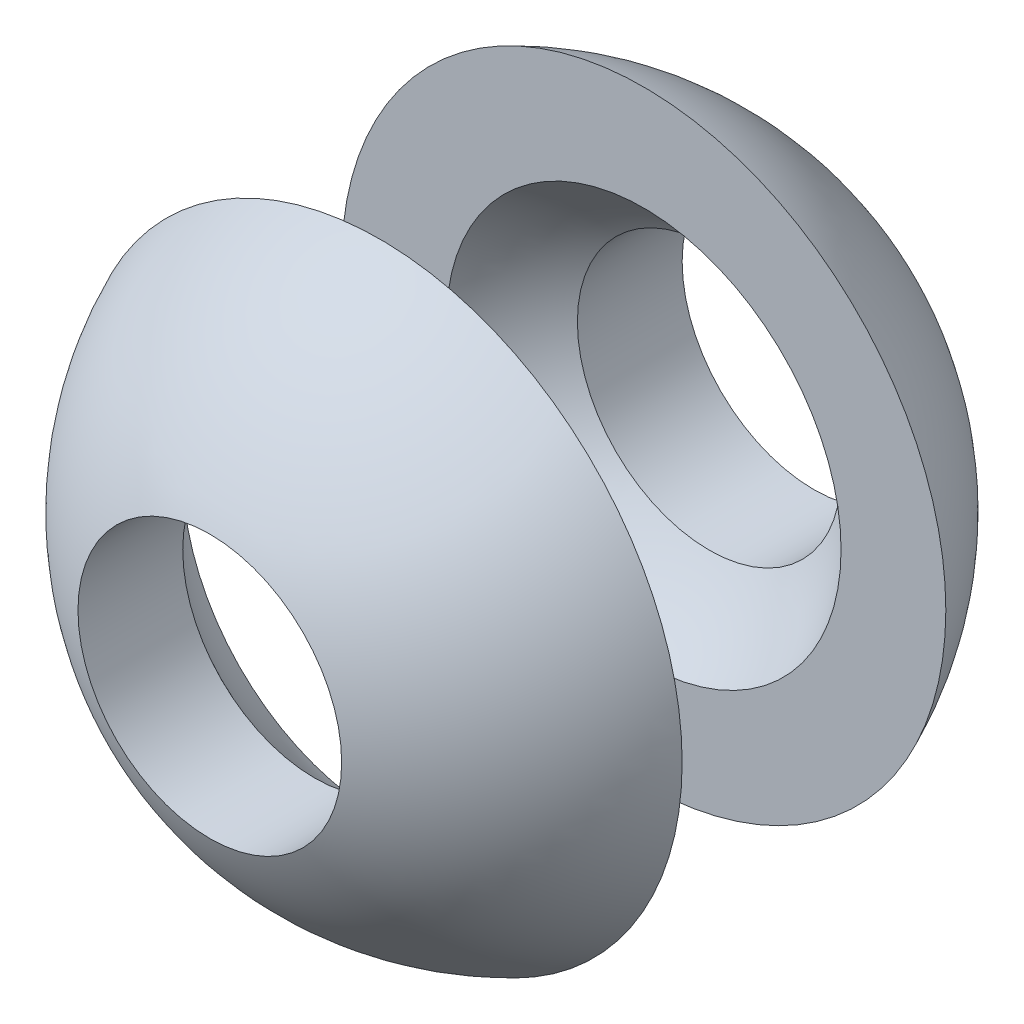
ISO-10303-21;
HEADER;
FILE_DESCRIPTION(('STEP AP214'),'2;1');
FILE_NAME('part.step','',(''),(''),'','','');
FILE_SCHEMA(('AUTOMOTIVE_DESIGN { 1 0 10303 214 1 1 1 1 }'));
ENDSEC;
DATA;
#1=APPLICATION_CONTEXT('core data for automotive mechanical design processes');
#2=APPLICATION_PROTOCOL_DEFINITION('international standard','automotive_design',2000,#1);
#3=PRODUCT_CONTEXT('',#1,'mechanical');
#4=PRODUCT('Part','Part','',(#3));
#5=PRODUCT_RELATED_PRODUCT_CATEGORY('part','',(#4));
#6=PRODUCT_DEFINITION_FORMATION('','',#4);
#7=PRODUCT_DEFINITION_CONTEXT('part definition',#1,'design');
#8=PRODUCT_DEFINITION('design','',#6,#7);
#9=PRODUCT_DEFINITION_SHAPE('','',#8);
#10=(LENGTH_UNIT() NAMED_UNIT(*) SI_UNIT(.MILLI.,.METRE.));
#11=(NAMED_UNIT(*) PLANE_ANGLE_UNIT() SI_UNIT($,.RADIAN.));
#12=(NAMED_UNIT(*) SI_UNIT($,.STERADIAN.) SOLID_ANGLE_UNIT());
#13=UNCERTAINTY_MEASURE_WITH_UNIT(LENGTH_MEASURE(1.E-05),#10,'distance_accuracy_value','');
#14=(GEOMETRIC_REPRESENTATION_CONTEXT(3) GLOBAL_UNCERTAINTY_ASSIGNED_CONTEXT((#13)) GLOBAL_UNIT_ASSIGNED_CONTEXT((#10,
#11,#12)) REPRESENTATION_CONTEXT('',''));
#15=CARTESIAN_POINT('',(0.,0.,0.));
#16=DIRECTION('',(0.,0.,1.));
#17=DIRECTION('',(1.,0.,0.));
#18=AXIS2_PLACEMENT_3D('',#15,#16,#17);
#19=CARTESIAN_POINT('',(0.,0.,-5.));
#20=DIRECTION('',(0.,0.,-1.));
#21=DIRECTION('',(-1.,0.,0.));
#22=AXIS2_PLACEMENT_3D('',#19,#20,#21);
#23=PLANE('',#22);
#24=CARTESIAN_POINT('',(0.,0.,-5.));
#25=DIRECTION('',(0.,0.,-1.));
#26=DIRECTION('',(-1.,0.,0.));
#27=AXIS2_PLACEMENT_3D('',#24,#25,#26);
#28=CIRCLE('',#27,11.4564392373896);
#29=CARTESIAN_POINT('',(11.4564392373896,0.,-5.));
#30=VERTEX_POINT('',#29);
#31=EDGE_CURVE('E11',#30,#30,#28,.T.);
#32=ORIENTED_EDGE('',*,*,#31,.F.);
#33=EDGE_LOOP('',(#32));
#34=FACE_BOUND('',#33,.T.);
#35=CARTESIAN_POINT('',(0.,0.,-5.));
#36=DIRECTION('',(0.,0.,-1.));
#37=DIRECTION('',(-1.,0.,0.));
#38=AXIS2_PLACEMENT_3D('',#35,#36,#37);
#39=CIRCLE('',#38,7.48331477354788);
#40=CARTESIAN_POINT('',(7.48331477354789,0.,-5.));
#41=VERTEX_POINT('',#40);
#42=EDGE_CURVE('E55',#41,#41,#39,.T.);
#43=ORIENTED_EDGE('',*,*,#42,.T.);
#44=EDGE_LOOP('',(#43));
#45=FACE_BOUND('',#44,.T.);
#46=ADVANCED_FACE('F41',(#34,#45),#23,.F.);
#47=CARTESIAN_POINT('',(0.,0.,0.));
#48=DIRECTION('',(0.,0.,-1.));
#49=DIRECTION('',(1.,0.,0.));
#50=AXIS2_PLACEMENT_3D('',#47,#48,#49);
#51=SPHERICAL_SURFACE('',#50,12.5);
#52=CARTESIAN_POINT('',(0.,0.,-11.4564392373896));
#53=DIRECTION('',(0.,0.,-1.));
#54=DIRECTION('',(-1.,0.,0.));
#55=AXIS2_PLACEMENT_3D('',#52,#53,#54);
#56=CIRCLE('',#55,5.);
#57=CARTESIAN_POINT('',(5.,0.,-11.4564392373896));
#58=VERTEX_POINT('',#57);
#59=EDGE_CURVE('E47',#58,#58,#56,.T.);
#60=CARTESIAN_POINT('',(5.,0.,-11.4564392373896));
#61=CARTESIAN_POINT('',(5.089236522876,0.,-11.4174934692092));
#62=CARTESIAN_POINT('',(5.17801782567667,0.,-11.3775046833718));
#63=CARTESIAN_POINT('',(5.35462192760605,0.,-11.29546379955));
#64=CARTESIAN_POINT('',(5.44244472673478,0.,-11.2534117015655));
#65=CARTESIAN_POINT('',(5.61708375779903,0.,-11.1672669166161));
#66=CARTESIAN_POINT('',(5.70389998973455,0.,-11.1231742296511));
#67=CARTESIAN_POINT('',(5.87647851273024,0.,-11.0329724059815));
#68=CARTESIAN_POINT('',(5.96224080379041,0.,-10.9868632692768));
#69=CARTESIAN_POINT('',(6.13266460924937,0.,-10.8926537055017));
#70=CARTESIAN_POINT('',(6.21732612364816,0.,-10.8445532784313));
#71=CARTESIAN_POINT('',(6.38550215111178,0.,-10.7463874022549));
#72=CARTESIAN_POINT('',(6.4690166641766,0.,-10.6963219531488));
#73=CARTESIAN_POINT('',(6.63485308788644,0.,-10.594253368363));
#74=CARTESIAN_POINT('',(6.71717499853145,0.,-10.5422502326833));
#75=CARTESIAN_POINT('',(6.88058126822237,0.,-10.4363346697823));
#76=CARTESIAN_POINT('',(6.96166562726828,0.,-10.3824222425609));
#77=CARTESIAN_POINT('',(7.12255252011474,0.,-10.2727175337012));
#78=CARTESIAN_POINT('',(7.20235505391529,0.,-10.2169252520628));
#79=CARTESIAN_POINT('',(7.36063472257772,0.,-10.1034912980417));
#80=CARTESIAN_POINT('',(7.4391118574396,0.,-10.0458496256589));
#81=CARTESIAN_POINT('',(7.59469787821051,0.,-9.92874836359419));
#82=CARTESIAN_POINT('',(7.67180676411955,0.,-9.8692887739123));
#83=CARTESIAN_POINT('',(7.82461418406438,0.,-9.74858414332025));
#84=CARTESIAN_POINT('',(7.90031271810016,0.,-9.68733910241008));
#85=CARTESIAN_POINT('',(8.05025810145604,0.,-9.56309701032052));
#86=CARTESIAN_POINT('',(8.12450495077614,0.,-9.50009995914114));
#87=CARTESIAN_POINT('',(8.27150642450601,0.,-9.37238824410378));
#88=CARTESIAN_POINT('',(8.34426104891579,0.,-9.30767358024581));
#89=CARTESIAN_POINT('',(8.48823834741356,0.,-9.17656197529102));
#90=CARTESIAN_POINT('',(8.55946102150155,0.,-9.11016503419421));
#91=CARTESIAN_POINT('',(8.70033553041838,0.,-8.97572512875694));
#92=CARTESIAN_POINT('',(8.76998736524721,0.,-8.90768216441648));
#93=CARTESIAN_POINT('',(8.90768216441649,0.,-8.7699873652472));
#94=CARTESIAN_POINT('',(8.97572512875694,0.,-8.70033553041837));
#95=CARTESIAN_POINT('',(9.11016503419421,0.,-8.55946102150155));
#96=CARTESIAN_POINT('',(9.17656197529102,0.,-8.48823834741356));
#97=CARTESIAN_POINT('',(9.30767358024581,0.,-8.34426104891579));
#98=CARTESIAN_POINT('',(9.37238824410378,0.,-8.27150642450601));
#99=CARTESIAN_POINT('',(9.50009995914114,0.,-8.12450495077614));
#100=CARTESIAN_POINT('',(9.56309701032053,0.,-8.05025810145604));
#101=CARTESIAN_POINT('',(9.68733910241008,0.,-7.90031271810015));
#102=CARTESIAN_POINT('',(9.74858414332025,0.,-7.82461418406437));
#103=CARTESIAN_POINT('',(9.8692887739123,0.,-7.67180676411955));
#104=CARTESIAN_POINT('',(9.92874836359419,0.,-7.59469787821051));
#105=CARTESIAN_POINT('',(10.0458496256589,0.,-7.43911185743959));
#106=CARTESIAN_POINT('',(10.1034912980417,0.,-7.36063472257772));
#107=CARTESIAN_POINT('',(10.2169252520628,0.,-7.20235505391529));
#108=CARTESIAN_POINT('',(10.2727175337012,0.,-7.12255252011473));
#109=CARTESIAN_POINT('',(10.3824222425609,0.,-6.96166562726827));
#110=CARTESIAN_POINT('',(10.4363346697823,0.,-6.88058126822237));
#111=CARTESIAN_POINT('',(10.5422502326833,0.,-6.71717499853145));
#112=CARTESIAN_POINT('',(10.594253368363,0.,-6.63485308788643));
#113=CARTESIAN_POINT('',(10.6963219531488,0.,-6.4690166641766));
#114=CARTESIAN_POINT('',(10.7463874022549,0.,-6.38550215111178));
#115=CARTESIAN_POINT('',(10.8445532784314,0.,-6.21732612364816));
#116=CARTESIAN_POINT('',(10.8926537055017,0.,-6.13266460924936));
#117=CARTESIAN_POINT('',(10.9868632692768,0.,-5.9622408037904));
#118=CARTESIAN_POINT('',(11.0329724059815,0.,-5.87647851273024));
#119=CARTESIAN_POINT('',(11.1231742296511,0.,-5.70389998973455));
#120=CARTESIAN_POINT('',(11.1672669166161,0.,-5.61708375779902));
#121=CARTESIAN_POINT('',(11.2534117015655,0.,-5.44244472673477));
#122=CARTESIAN_POINT('',(11.29546379955,0.,-5.35462192760605));
#123=CARTESIAN_POINT('',(11.3775046833718,0.,-5.17801782567666));
#124=CARTESIAN_POINT('',(11.4174934692092,0.,-5.089236522876));
#125=CARTESIAN_POINT('',(11.4564392373896,0.,-5.));
#126=B_SPLINE_CURVE_WITH_KNOTS('',3,(#60,#61,#62,#63,#64,#65,#66,#67,#68,#69,#70,#71,#72,#73,
#74,#75,#76,#77,#78,#79,#80,#81,#82,#83,#84,#85,#86,#87,#88,#89,#90,#91,#92,#93,#94,#95,#96,#97,
#98,#99,#100,#101,#102,#103,#104,#105,#106,#107,#108,#109,#110,#111,#112,#113,#114,#115,#116,
#117,#118,#119,#120,#121,#122,#123,#124,#125),.UNSPECIFIED.,.F.,.F.,(4,2,2,2,2,2,2,2,2,2,2,2,2,
2,2,2,2,2,2,2,2,2,2,2,2,2,2,2,2,2,2,2,4),(0.,0.292088133518826,0.584176267037652,
0.876264400556478,1.1683525340753,1.46044066759413,1.75252880111296,2.04461693463178,
2.33670506815061,2.62879320166943,2.92088133518826,3.21296946870708,3.50505760222591,
3.79714573574474,4.08923386926356,4.38132200278239,4.67341013630121,4.96549826982004,
5.25758640333886,5.54967453685769,5.84176267037651,6.13385080389534,6.42593893741417,
6.71802707093299,7.01011520445182,7.30220333797064,7.59429147148947,7.8863796050083,
8.17846773852712,8.47055587204595,8.76264400556477,9.0547321390836,9.34682027260242),.UNSPECIFIED.);
#127=EDGE_CURVE('BSEAM70',#58,#30,#126,.T.);
#128=ORIENTED_EDGE('',*,*,#59,.F.);
#129=ORIENTED_EDGE('',*,*,#31,.T.);
#130=ORIENTED_EDGE('',*,*,#127,.T.);
#131=ORIENTED_EDGE('',*,*,#127,.F.);
#132=EDGE_LOOP('',(#128,#130,#129,#131));
#133=FACE_BOUND('',#132,.T.);
#134=ADVANCED_FACE('F70',(#133),#51,.T.);
#135=CARTESIAN_POINT('',(0.,0.,-14.5151869158878));
#136=DIRECTION('',(0.,0.,-1.));
#137=DIRECTION('',(-1.,0.,0.));
#138=AXIS2_PLACEMENT_3D('',#135,#136,#137);
#139=CYLINDRICAL_SURFACE('',#138,5.);
#140=CARTESIAN_POINT('',(0.,0.,-7.48331477354788));
#141=DIRECTION('',(0.,0.,-1.));
#142=DIRECTION('',(-1.,0.,0.));
#143=AXIS2_PLACEMENT_3D('',#140,#141,#142);
#144=CIRCLE('',#143,5.);
#145=CARTESIAN_POINT('',(5.00000000000001,0.,-7.48331477354788));
#146=VERTEX_POINT('',#145);
#147=EDGE_CURVE('E51',#146,#146,#144,.T.);
#148=ORIENTED_EDGE('',*,*,#147,.F.);
#149=EDGE_LOOP('',(#148));
#150=FACE_BOUND('',#149,.T.);
#151=ORIENTED_EDGE('',*,*,#59,.T.);
#152=EDGE_LOOP('',(#151));
#153=FACE_BOUND('',#152,.T.);
#154=ADVANCED_FACE('F64',(#150,#153),#139,.F.);
#155=CARTESIAN_POINT('',(0.,0.,0.));
#156=DIRECTION('',(0.,0.,-1.));
#157=DIRECTION('',(1.,0.,0.));
#158=AXIS2_PLACEMENT_3D('',#155,#156,#157);
#159=SPHERICAL_SURFACE('',#158,9.);
#160=CARTESIAN_POINT('',(5.00000000000001,0.,-7.48331477354788));
#161=CARTESIAN_POINT('',(5.03061412186364,0.,-7.46285986767188));
#162=CARTESIAN_POINT('',(5.06110270910047,0.,-7.44221707923801));
#163=CARTESIAN_POINT('',(5.12182425239296,0.,-7.40055889080514));
#164=CARTESIAN_POINT('',(5.15205720844864,0.,-7.37954349080614));
#165=CARTESIAN_POINT('',(5.21226292745134,0.,-7.33714323279364));
#166=CARTESIAN_POINT('',(5.24223569039837,0.,-7.31575837478013));
#167=CARTESIAN_POINT('',(5.30191651076454,0.,-7.27262242497662));
#168=CARTESIAN_POINT('',(5.33162456818369,0.,-7.25087133318662));
#169=CARTESIAN_POINT('',(5.3907715021813,0.,-7.20700619120199));
#170=CARTESIAN_POINT('',(5.42021037875975,0.,-7.18489214100737));
#171=CARTESIAN_POINT('',(5.47881451704878,0.,-7.14030441333512));
#172=CARTESIAN_POINT('',(5.50797977875936,0.,-7.11783073585749));
#173=CARTESIAN_POINT('',(5.56603229429982,0.,-7.0725271386198));
#174=CARTESIAN_POINT('',(5.59491954812969,0.,-7.04969721885975));
#175=CARTESIAN_POINT('',(5.65241169682356,0.,-7.00368457579375));
#176=CARTESIAN_POINT('',(5.68101659168756,0.,-6.9805018524878));
#177=CARTESIAN_POINT('',(5.73793971388013,0.,-6.93378709418625));
#178=CARTESIAN_POINT('',(5.76625794120871,0.,-6.91025505919065));
#179=CARTESIAN_POINT('',(5.82260346294354,0.,-6.86284522198608));
#180=CARTESIAN_POINT('',(5.8506307573498,0.,-6.83896741977713));
#181=CARTESIAN_POINT('',(5.90639019167338,0.,-6.79086964470131));
#182=CARTESIAN_POINT('',(5.93412233159072,0.,-6.76664967183445));
#183=CARTESIAN_POINT('',(5.98928727982729,0.,-6.7178712035376));
#184=CARTESIAN_POINT('',(6.01672008814654,0.,-6.6933127081076));
#185=CARTESIAN_POINT('',(6.07128224116405,0.,-6.64386089376854));
#186=CARTESIAN_POINT('',(6.09841158586231,0.,-6.61896757485948));
#187=CARTESIAN_POINT('',(6.15236272532371,0.,-6.56884986307864));
#188=CARTESIAN_POINT('',(6.17918452008685,0.,-6.54362547020686));
#189=CARTESIAN_POINT('',(6.23251651968805,0.,-6.49284940988442));
#190=CARTESIAN_POINT('',(6.25902672452612,0.,-6.46729774243375));
#191=CARTESIAN_POINT('',(6.31173155121998,0.,-6.41587098163258));
#192=CARTESIAN_POINT('',(6.33792617307578,0.,-6.38999588828208));
#193=CARTESIAN_POINT('',(6.38999588828208,0.,-6.33792617307577));
#194=CARTESIAN_POINT('',(6.41587098163259,0.,-6.31173155121998));
#195=CARTESIAN_POINT('',(6.46729774243376,0.,-6.25902672452611));
#196=CARTESIAN_POINT('',(6.49284940988442,0.,-6.23251651968804));
#197=CARTESIAN_POINT('',(6.54362547020687,0.,-6.17918452008684));
#198=CARTESIAN_POINT('',(6.56884986307864,0.,-6.1523627253237));
#199=CARTESIAN_POINT('',(6.61896757485949,0.,-6.0984115858623));
#200=CARTESIAN_POINT('',(6.64386089376855,0.,-6.07128224116404));
#201=CARTESIAN_POINT('',(6.69331270810761,0.,-6.01672008814653));
#202=CARTESIAN_POINT('',(6.71787120353761,0.,-5.98928727982729));
#203=CARTESIAN_POINT('',(6.76664967183446,0.,-5.93412233159071));
#204=CARTESIAN_POINT('',(6.79086964470132,0.,-5.90639019167338));
#205=CARTESIAN_POINT('',(6.83896741977713,0.,-5.85063075734979));
#206=CARTESIAN_POINT('',(6.86284522198609,0.,-5.82260346294353));
#207=CARTESIAN_POINT('',(6.91025505919065,0.,-5.7662579412087));
#208=CARTESIAN_POINT('',(6.93378709418626,0.,-5.73793971388013));
#209=CARTESIAN_POINT('',(6.98050185248781,0.,-5.68101659168755));
#210=CARTESIAN_POINT('',(7.00368457579376,0.,-5.65241169682356));
#211=CARTESIAN_POINT('',(7.04969721885975,0.,-5.59491954812968));
#212=CARTESIAN_POINT('',(7.07252713861981,0.,-5.56603229429981));
#213=CARTESIAN_POINT('',(7.11783073585749,0.,-5.50797977875935));
#214=CARTESIAN_POINT('',(7.14030441333513,0.,-5.47881451704877));
#215=CARTESIAN_POINT('',(7.18489214100738,0.,-5.42021037875974));
#216=CARTESIAN_POINT('',(7.207006191202,0.,-5.39077150218129));
#217=CARTESIAN_POINT('',(7.25087133318663,0.,-5.33162456818369));
#218=CARTESIAN_POINT('',(7.27262242497663,0.,-5.30191651076453));
#219=CARTESIAN_POINT('',(7.31575837478014,0.,-5.24223569039836));
#220=CARTESIAN_POINT('',(7.33714323279365,0.,-5.21226292745134));
#221=CARTESIAN_POINT('',(7.37954349080615,0.,-5.15205720844863));
#222=CARTESIAN_POINT('',(7.40055889080515,0.,-5.12182425239296));
#223=CARTESIAN_POINT('',(7.44221707923801,0.,-5.06110270910046));
#224=CARTESIAN_POINT('',(7.46285986767188,0.,-5.03061412186363));
#225=CARTESIAN_POINT('',(7.48331477354789,0.,-5.));
#226=B_SPLINE_CURVE_WITH_KNOTS('',3,(#160,#161,#162,#163,#164,#165,#166,#167,#168,#169,#170,
#171,#172,#173,#174,#175,#176,#177,#178,#179,#180,#181,#182,#183,#184,#185,#186,#187,#188,#189,
#190,#191,#192,#193,#194,#195,#196,#197,#198,#199,#200,#201,#202,#203,#204,#205,#206,#207,#208,
#209,#210,#211,#212,#213,#214,#215,#216,#217,#218,#219,#220,#221,#222,#223,#224,#225),
.UNSPECIFIED.,.F.,.F.,(4,2,2,2,2,2,2,2,2,2,2,2,2,2,2,2,2,2,2,2,2,2,2,2,2,2,2,2,2,2,2,2,4),(0.,
0.110455852934489,0.220911705868978,0.331367558803467,0.441823411737956,0.552279264672446,
0.662735117606935,0.773190970541425,0.883646823475913,0.994102676410403,1.10455852934489,
1.21501438227938,1.32547023521387,1.43592608814836,1.54638194108285,1.65683779401734,
1.76729364695183,1.87774949988632,1.98820535282081,2.0986612057553,2.20911705868978,
2.31957291162427,2.43002876455876,2.54048461749325,2.65094047042774,2.76139632336223,
2.87185217629672,2.98230802923121,3.0927638821657,3.20321973510019,3.31367558803468,
3.42413144096917,3.53458729390366),.UNSPECIFIED.);
#227=EDGE_CURVE('BSEAM62',#146,#41,#226,.T.);
#228=ORIENTED_EDGE('',*,*,#147,.T.);
#229=ORIENTED_EDGE('',*,*,#42,.F.);
#230=ORIENTED_EDGE('',*,*,#227,.T.);
#231=ORIENTED_EDGE('',*,*,#227,.F.);
#232=EDGE_LOOP('',(#228,#230,#229,#231));
#233=FACE_BOUND('',#232,.T.);
#234=ADVANCED_FACE('F62',(#233),#159,.F.);
#235=CLOSED_SHELL('',(#46,#134,#154,#234));
#236=MANIFOLD_SOLID_BREP('B2',#235);
#237=CARTESIAN_POINT('',(0.,0.,0.));
#238=DIRECTION('',(0.,0.,-1.));
#239=DIRECTION('',(1.,0.,0.));
#240=AXIS2_PLACEMENT_3D('',#237,#238,#239);
#241=SPHERICAL_SURFACE('',#240,9.);
#242=CARTESIAN_POINT('',(0.,0.,5.));
#243=DIRECTION('',(0.,0.,-1.));
#244=DIRECTION('',(-1.,0.,0.));
#245=AXIS2_PLACEMENT_3D('',#242,#243,#244);
#246=CIRCLE('',#245,7.48331477354788);
#247=CARTESIAN_POINT('',(7.48331477354788,0.,5.));
#248=VERTEX_POINT('',#247);
#249=EDGE_CURVE('E117',#248,#248,#246,.T.);
#250=CARTESIAN_POINT('',(0.,0.,7.48331477354788));
#251=DIRECTION('',(0.,0.,-1.));
#252=DIRECTION('',(-1.,0.,0.));
#253=AXIS2_PLACEMENT_3D('',#250,#251,#252);
#254=CIRCLE('',#253,5.);
#255=CARTESIAN_POINT('',(5.,0.,7.48331477354788));
#256=VERTEX_POINT('',#255);
#257=EDGE_CURVE('E40',#256,#256,#254,.T.);
#258=CARTESIAN_POINT('',(7.48331477354788,0.,5.));
#259=CARTESIAN_POINT('',(7.46285986767188,0.,5.03061412186364));
#260=CARTESIAN_POINT('',(7.44221707923801,0.,5.06110270910046));
#261=CARTESIAN_POINT('',(7.40055889080514,0.,5.12182425239296));
#262=CARTESIAN_POINT('',(7.37954349080615,0.,5.15205720844864));
#263=CARTESIAN_POINT('',(7.33714323279364,0.,5.21226292745134));
#264=CARTESIAN_POINT('',(7.31575837478013,0.,5.24223569039836));
#265=CARTESIAN_POINT('',(7.27262242497662,0.,5.30191651076453));
#266=CARTESIAN_POINT('',(7.25087133318662,0.,5.33162456818369));
#267=CARTESIAN_POINT('',(7.207006191202,0.,5.39077150218129));
#268=CARTESIAN_POINT('',(7.18489214100737,0.,5.42021037875974));
#269=CARTESIAN_POINT('',(7.14030441333512,0.,5.47881451704877));
#270=CARTESIAN_POINT('',(7.11783073585749,0.,5.50797977875935));
#271=CARTESIAN_POINT('',(7.0725271386198,0.,5.56603229429981));
#272=CARTESIAN_POINT('',(7.04969721885975,0.,5.59491954812968));
#273=CARTESIAN_POINT('',(7.00368457579375,0.,5.65241169682356));
#274=CARTESIAN_POINT('',(6.9805018524878,0.,5.68101659168756));
#275=CARTESIAN_POINT('',(6.93378709418625,0.,5.73793971388013));
#276=CARTESIAN_POINT('',(6.91025505919065,0.,5.7662579412087));
#277=CARTESIAN_POINT('',(6.86284522198608,0.,5.82260346294353));
#278=CARTESIAN_POINT('',(6.83896741977713,0.,5.85063075734979));
#279=CARTESIAN_POINT('',(6.79086964470131,0.,5.90639019167338));
#280=CARTESIAN_POINT('',(6.76664967183445,0.,5.93412233159071));
#281=CARTESIAN_POINT('',(6.7178712035376,0.,5.98928727982729));
#282=CARTESIAN_POINT('',(6.69331270810761,0.,6.01672008814653));
#283=CARTESIAN_POINT('',(6.64386089376854,0.,6.07128224116404));
#284=CARTESIAN_POINT('',(6.61896757485948,0.,6.0984115858623));
#285=CARTESIAN_POINT('',(6.56884986307864,0.,6.15236272532371));
#286=CARTESIAN_POINT('',(6.54362547020686,0.,6.17918452008684));
#287=CARTESIAN_POINT('',(6.49284940988442,0.,6.23251651968804));
#288=CARTESIAN_POINT('',(6.46729774243375,0.,6.25902672452611));
#289=CARTESIAN_POINT('',(6.41587098163258,0.,6.31173155121998));
#290=CARTESIAN_POINT('',(6.38999588828208,0.,6.33792617307577));
#291=CARTESIAN_POINT('',(6.33792617307577,0.,6.38999588828208));
#292=CARTESIAN_POINT('',(6.31173155121998,0.,6.41587098163258));
#293=CARTESIAN_POINT('',(6.25902672452611,0.,6.46729774243375));
#294=CARTESIAN_POINT('',(6.23251651968804,0.,6.49284940988442));
#295=CARTESIAN_POINT('',(6.17918452008684,0.,6.54362547020686));
#296=CARTESIAN_POINT('',(6.15236272532371,0.,6.56884986307864));
#297=CARTESIAN_POINT('',(6.09841158586231,0.,6.61896757485948));
#298=CARTESIAN_POINT('',(6.07128224116404,0.,6.64386089376854));
#299=CARTESIAN_POINT('',(6.01672008814653,0.,6.6933127081076));
#300=CARTESIAN_POINT('',(5.98928727982729,0.,6.7178712035376));
#301=CARTESIAN_POINT('',(5.93412233159071,0.,6.76664967183445));
#302=CARTESIAN_POINT('',(5.90639019167338,0.,6.79086964470131));
#303=CARTESIAN_POINT('',(5.85063075734979,0.,6.83896741977713));
#304=CARTESIAN_POINT('',(5.82260346294353,0.,6.86284522198608));
#305=CARTESIAN_POINT('',(5.7662579412087,0.,6.91025505919065));
#306=CARTESIAN_POINT('',(5.73793971388013,0.,6.93378709418625));
#307=CARTESIAN_POINT('',(5.68101659168756,0.,6.9805018524878));
#308=CARTESIAN_POINT('',(5.65241169682356,0.,7.00368457579375));
#309=CARTESIAN_POINT('',(5.59491954812968,0.,7.04969721885975));
#310=CARTESIAN_POINT('',(5.56603229429981,0.,7.0725271386198));
#311=CARTESIAN_POINT('',(5.50797977875936,0.,7.11783073585749));
#312=CARTESIAN_POINT('',(5.47881451704877,0.,7.14030441333512));
#313=CARTESIAN_POINT('',(5.42021037875974,0.,7.18489214100737));
#314=CARTESIAN_POINT('',(5.39077150218129,0.,7.207006191202));
#315=CARTESIAN_POINT('',(5.33162456818369,0.,7.25087133318662));
#316=CARTESIAN_POINT('',(5.30191651076454,0.,7.27262242497662));
#317=CARTESIAN_POINT('',(5.24223569039836,0.,7.31575837478013));
#318=CARTESIAN_POINT('',(5.21226292745134,0.,7.33714323279364));
#319=CARTESIAN_POINT('',(5.15205720844864,0.,7.37954349080614));
#320=CARTESIAN_POINT('',(5.12182425239296,0.,7.40055889080514));
#321=CARTESIAN_POINT('',(5.06110270910046,0.,7.44221707923801));
#322=CARTESIAN_POINT('',(5.03061412186364,0.,7.46285986767188));
#323=CARTESIAN_POINT('',(5.,0.,7.48331477354788));
#324=B_SPLINE_CURVE_WITH_KNOTS('',3,(#258,#259,#260,#261,#262,#263,#264,#265,#266,#267,#268,
#269,#270,#271,#272,#273,#274,#275,#276,#277,#278,#279,#280,#281,#282,#283,#284,#285,#286,#287,
#288,#289,#290,#291,#292,#293,#294,#295,#296,#297,#298,#299,#300,#301,#302,#303,#304,#305,#306,
#307,#308,#309,#310,#311,#312,#313,#314,#315,#316,#317,#318,#319,#320,#321,#322,#323),
.UNSPECIFIED.,.F.,.F.,(4,2,2,2,2,2,2,2,2,2,2,2,2,2,2,2,2,2,2,2,2,2,2,2,2,2,2,2,2,2,2,2,4),(0.,
0.110455852934489,0.220911705868979,0.331367558803468,0.441823411737957,0.552279264672446,
0.662735117606936,0.773190970541425,0.883646823475915,0.994102676410403,1.10455852934489,
1.21501438227938,1.32547023521387,1.43592608814836,1.54638194108285,1.65683779401734,
1.76729364695183,1.87774949988632,1.98820535282081,2.0986612057553,2.20911705868979,
2.31957291162428,2.43002876455876,2.54048461749325,2.65094047042774,2.76139632336223,
2.87185217629672,2.98230802923121,3.0927638821657,3.20321973510019,3.31367558803468,
3.42413144096917,3.53458729390366),.UNSPECIFIED.);
#325=EDGE_CURVE('BSEAM103',#248,#256,#324,.T.);
#326=ORIENTED_EDGE('',*,*,#249,.T.);
#327=ORIENTED_EDGE('',*,*,#257,.F.);
#328=ORIENTED_EDGE('',*,*,#325,.T.);
#329=ORIENTED_EDGE('',*,*,#325,.F.);
#330=EDGE_LOOP('',(#326,#328,#327,#329));
#331=FACE_BOUND('',#330,.T.);
#332=ADVANCED_FACE('F103',(#331),#241,.F.);
#333=CARTESIAN_POINT('',(0.,0.,-14.5151869158878));
#334=DIRECTION('',(0.,0.,-1.));
#335=DIRECTION('',(-1.,0.,0.));
#336=AXIS2_PLACEMENT_3D('',#333,#334,#335);
#337=CYLINDRICAL_SURFACE('',#336,5.);
#338=CARTESIAN_POINT('',(0.,0.,11.4564392373896));
#339=DIRECTION('',(0.,0.,-1.));
#340=DIRECTION('',(-1.,0.,0.));
#341=AXIS2_PLACEMENT_3D('',#338,#339,#340);
#342=CIRCLE('',#341,5.);
#343=CARTESIAN_POINT('',(5.,0.,11.4564392373896));
#344=VERTEX_POINT('',#343);
#345=EDGE_CURVE('E109',#344,#344,#342,.T.);
#346=ORIENTED_EDGE('',*,*,#345,.F.);
#347=EDGE_LOOP('',(#346));
#348=FACE_BOUND('',#347,.T.);
#349=ORIENTED_EDGE('',*,*,#257,.T.);
#350=EDGE_LOOP('',(#349));
#351=FACE_BOUND('',#350,.T.);
#352=ADVANCED_FACE('F133',(#348,#351),#337,.F.);
#353=CARTESIAN_POINT('',(0.,0.,0.));
#354=DIRECTION('',(0.,0.,-1.));
#355=DIRECTION('',(1.,0.,0.));
#356=AXIS2_PLACEMENT_3D('',#353,#354,#355);
#357=SPHERICAL_SURFACE('',#356,12.5);
#358=CARTESIAN_POINT('',(0.,0.,5.));
#359=DIRECTION('',(0.,0.,-1.));
#360=DIRECTION('',(-1.,0.,0.));
#361=AXIS2_PLACEMENT_3D('',#358,#359,#360);
#362=CIRCLE('',#361,11.4564392373896);
#363=CARTESIAN_POINT('',(11.4564392373896,0.,5.));
#364=VERTEX_POINT('',#363);
#365=EDGE_CURVE('E113',#364,#364,#362,.T.);
#366=CARTESIAN_POINT('',(11.4564392373896,0.,5.));
#367=CARTESIAN_POINT('',(11.4174934692092,0.,5.089236522876));
#368=CARTESIAN_POINT('',(11.3775046833719,0.,5.17801782567666));
#369=CARTESIAN_POINT('',(11.29546379955,0.,5.35462192760605));
#370=CARTESIAN_POINT('',(11.2534117015655,0.,5.44244472673477));
#371=CARTESIAN_POINT('',(11.1672669166161,0.,5.61708375779903));
#372=CARTESIAN_POINT('',(11.1231742296511,0.,5.70389998973455));
#373=CARTESIAN_POINT('',(11.0329724059815,0.,5.87647851273024));
#374=CARTESIAN_POINT('',(10.9868632692768,0.,5.9622408037904));
#375=CARTESIAN_POINT('',(10.8926537055017,0.,6.13266460924936));
#376=CARTESIAN_POINT('',(10.8445532784314,0.,6.21732612364816));
#377=CARTESIAN_POINT('',(10.7463874022549,0.,6.38550215111178));
#378=CARTESIAN_POINT('',(10.6963219531488,0.,6.4690166641766));
#379=CARTESIAN_POINT('',(10.594253368363,0.,6.63485308788643));
#380=CARTESIAN_POINT('',(10.5422502326833,0.,6.71717499853145));
#381=CARTESIAN_POINT('',(10.4363346697823,0.,6.88058126822237));
#382=CARTESIAN_POINT('',(10.3824222425609,0.,6.96166562726828));
#383=CARTESIAN_POINT('',(10.2727175337012,0.,7.12255252011474));
#384=CARTESIAN_POINT('',(10.2169252520628,0.,7.20235505391529));
#385=CARTESIAN_POINT('',(10.1034912980417,0.,7.36063472257772));
#386=CARTESIAN_POINT('',(10.0458496256589,0.,7.4391118574396));
#387=CARTESIAN_POINT('',(9.92874836359419,0.,7.59469787821051));
#388=CARTESIAN_POINT('',(9.8692887739123,0.,7.67180676411955));
#389=CARTESIAN_POINT('',(9.74858414332025,0.,7.82461418406438));
#390=CARTESIAN_POINT('',(9.68733910241008,0.,7.90031271810016));
#391=CARTESIAN_POINT('',(9.56309701032052,0.,8.05025810145604));
#392=CARTESIAN_POINT('',(9.50009995914114,0.,8.12450495077614));
#393=CARTESIAN_POINT('',(9.37238824410378,0.,8.27150642450601));
#394=CARTESIAN_POINT('',(9.30767358024581,0.,8.34426104891579));
#395=CARTESIAN_POINT('',(9.17656197529102,0.,8.48823834741356));
#396=CARTESIAN_POINT('',(9.11016503419421,0.,8.55946102150156));
#397=CARTESIAN_POINT('',(8.97572512875694,0.,8.70033553041838));
#398=CARTESIAN_POINT('',(8.90768216441648,0.,8.76998736524721));
#399=CARTESIAN_POINT('',(8.7699873652472,0.,8.90768216441649));
#400=CARTESIAN_POINT('',(8.70033553041837,0.,8.97572512875694));
#401=CARTESIAN_POINT('',(8.55946102150155,0.,9.11016503419421));
#402=CARTESIAN_POINT('',(8.48823834741356,0.,9.17656197529102));
#403=CARTESIAN_POINT('',(8.34426104891579,0.,9.30767358024581));
#404=CARTESIAN_POINT('',(8.27150642450601,0.,9.37238824410378));
#405=CARTESIAN_POINT('',(8.12450495077613,0.,9.50009995914114));
#406=CARTESIAN_POINT('',(8.05025810145603,0.,9.56309701032053));
#407=CARTESIAN_POINT('',(7.90031271810015,0.,9.68733910241008));
#408=CARTESIAN_POINT('',(7.82461418406437,0.,9.74858414332025));
#409=CARTESIAN_POINT('',(7.67180676411955,0.,9.8692887739123));
#410=CARTESIAN_POINT('',(7.59469787821051,0.,9.92874836359419));
#411=CARTESIAN_POINT('',(7.43911185743959,0.,10.0458496256589));
#412=CARTESIAN_POINT('',(7.36063472257772,0.,10.1034912980417));
#413=CARTESIAN_POINT('',(7.20235505391529,0.,10.2169252520628));
#414=CARTESIAN_POINT('',(7.12255252011473,0.,10.2727175337012));
#415=CARTESIAN_POINT('',(6.96166562726827,0.,10.3824222425609));
#416=CARTESIAN_POINT('',(6.88058126822237,0.,10.4363346697823));
#417=CARTESIAN_POINT('',(6.71717499853145,0.,10.5422502326833));
#418=CARTESIAN_POINT('',(6.63485308788643,0.,10.594253368363));
#419=CARTESIAN_POINT('',(6.4690166641766,0.,10.6963219531488));
#420=CARTESIAN_POINT('',(6.38550215111177,0.,10.7463874022549));
#421=CARTESIAN_POINT('',(6.21732612364816,0.,10.8445532784314));
#422=CARTESIAN_POINT('',(6.13266460924936,0.,10.8926537055017));
#423=CARTESIAN_POINT('',(5.9622408037904,0.,10.9868632692768));
#424=CARTESIAN_POINT('',(5.87647851273024,0.,11.0329724059815));
#425=CARTESIAN_POINT('',(5.70389998973455,0.,11.1231742296511));
#426=CARTESIAN_POINT('',(5.61708375779902,0.,11.1672669166161));
#427=CARTESIAN_POINT('',(5.44244472673477,0.,11.2534117015655));
#428=CARTESIAN_POINT('',(5.35462192760605,0.,11.29546379955));
#429=CARTESIAN_POINT('',(5.17801782567666,0.,11.3775046833719));
#430=CARTESIAN_POINT('',(5.089236522876,0.,11.4174934692092));
#431=CARTESIAN_POINT('',(5.,0.,11.4564392373896));
#432=B_SPLINE_CURVE_WITH_KNOTS('',3,(#366,#367,#368,#369,#370,#371,#372,#373,#374,#375,#376,
#377,#378,#379,#380,#381,#382,#383,#384,#385,#386,#387,#388,#389,#390,#391,#392,#393,#394,#395,
#396,#397,#398,#399,#400,#401,#402,#403,#404,#405,#406,#407,#408,#409,#410,#411,#412,#413,#414,
#415,#416,#417,#418,#419,#420,#421,#422,#423,#424,#425,#426,#427,#428,#429,#430,#431),
.UNSPECIFIED.,.F.,.F.,(4,2,2,2,2,2,2,2,2,2,2,2,2,2,2,2,2,2,2,2,2,2,2,2,2,2,2,2,2,2,2,2,4),(0.,
0.292088133518826,0.584176267037652,0.876264400556478,1.1683525340753,1.46044066759413,
1.75252880111296,2.04461693463178,2.33670506815061,2.62879320166943,2.92088133518826,
3.21296946870709,3.50505760222591,3.79714573574474,4.08923386926356,4.38132200278239,
4.67341013630122,4.96549826982004,5.25758640333887,5.54967453685769,5.84176267037652,
6.13385080389534,6.42593893741417,6.718027070933,7.01011520445182,7.30220333797065,
7.59429147148947,7.8863796050083,8.17846773852713,8.47055587204595,8.76264400556478,
9.0547321390836,9.34682027260243),.UNSPECIFIED.);
#433=EDGE_CURVE('BSEAM127',#364,#344,#432,.T.);
#434=ORIENTED_EDGE('',*,*,#365,.F.);
#435=ORIENTED_EDGE('',*,*,#345,.T.);
#436=ORIENTED_EDGE('',*,*,#433,.T.);
#437=ORIENTED_EDGE('',*,*,#433,.F.);
#438=EDGE_LOOP('',(#434,#436,#435,#437));
#439=FACE_BOUND('',#438,.T.);
#440=ADVANCED_FACE('F127',(#439),#357,.T.);
#441=CARTESIAN_POINT('',(0.,0.,5.));
#442=DIRECTION('',(0.,0.,-1.));
#443=DIRECTION('',(-1.,0.,0.));
#444=AXIS2_PLACEMENT_3D('',#441,#442,#443);
#445=PLANE('',#444);
#446=ORIENTED_EDGE('',*,*,#365,.T.);
#447=EDGE_LOOP('',(#446));
#448=FACE_BOUND('',#447,.T.);
#449=ORIENTED_EDGE('',*,*,#249,.F.);
#450=EDGE_LOOP('',(#449));
#451=FACE_BOUND('',#450,.T.);
#452=ADVANCED_FACE('F125',(#448,#451),#445,.T.);
#453=CLOSED_SHELL('',(#332,#352,#440,#452));
#454=MANIFOLD_SOLID_BREP('B6',#453);
#455=ADVANCED_BREP_SHAPE_REPRESENTATION('',(#18,#236,#454),#14);
#456=SHAPE_DEFINITION_REPRESENTATION(#9,#455);
ENDSEC;
END-ISO-10303-21;
